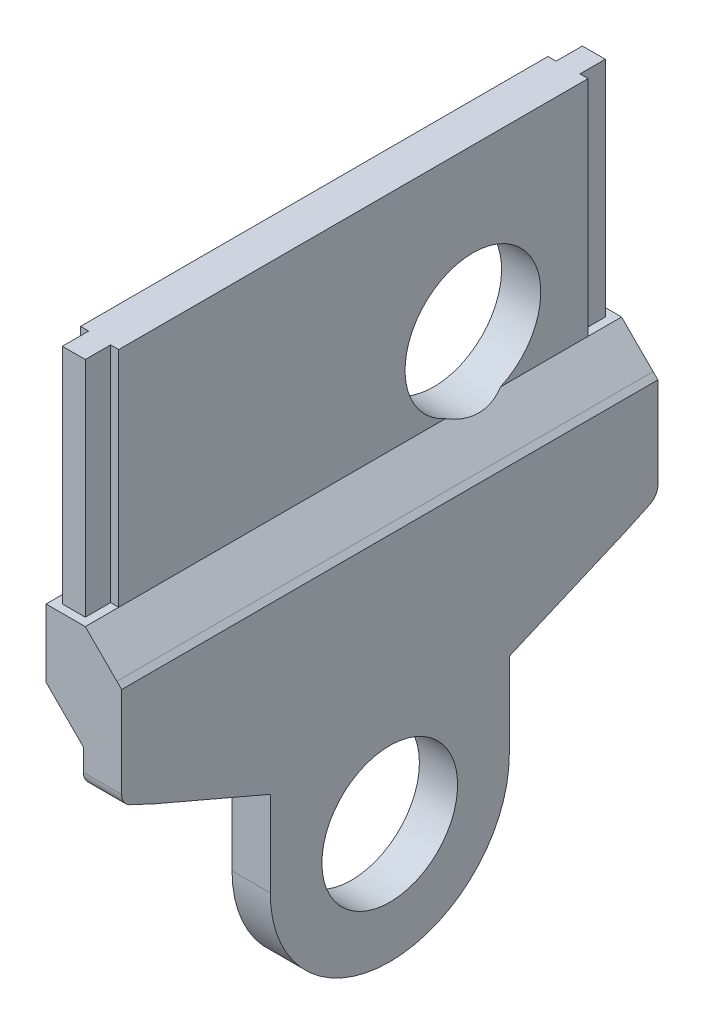
ISO-10303-21;
HEADER;
FILE_DESCRIPTION(('STEP AP214'),'2;1');
FILE_NAME('part.step','',(''),(''),'','','');
FILE_SCHEMA(('AUTOMOTIVE_DESIGN { 1 0 10303 214 1 1 1 1 }'));
ENDSEC;
DATA;
#1=APPLICATION_CONTEXT('core data for automotive mechanical design processes');
#2=APPLICATION_PROTOCOL_DEFINITION('international standard','automotive_design',2000,#1);
#3=PRODUCT_CONTEXT('',#1,'mechanical');
#4=PRODUCT('Part','Part','',(#3));
#5=PRODUCT_RELATED_PRODUCT_CATEGORY('part','',(#4));
#6=PRODUCT_DEFINITION_FORMATION('','',#4);
#7=PRODUCT_DEFINITION_CONTEXT('part definition',#1,'design');
#8=PRODUCT_DEFINITION('design','',#6,#7);
#9=PRODUCT_DEFINITION_SHAPE('','',#8);
#10=(LENGTH_UNIT() NAMED_UNIT(*) SI_UNIT(.MILLI.,.METRE.));
#11=(NAMED_UNIT(*) PLANE_ANGLE_UNIT() SI_UNIT($,.RADIAN.));
#12=(NAMED_UNIT(*) SI_UNIT($,.STERADIAN.) SOLID_ANGLE_UNIT());
#13=UNCERTAINTY_MEASURE_WITH_UNIT(LENGTH_MEASURE(1.E-05),#10,'distance_accuracy_value','');
#14=(GEOMETRIC_REPRESENTATION_CONTEXT(3) GLOBAL_UNCERTAINTY_ASSIGNED_CONTEXT((#13)) GLOBAL_UNIT_ASSIGNED_CONTEXT((#10,
#11,#12)) REPRESENTATION_CONTEXT('',''));
#15=CARTESIAN_POINT('',(0.,0.,0.));
#16=DIRECTION('',(0.,0.,1.));
#17=DIRECTION('',(1.,0.,0.));
#18=AXIS2_PLACEMENT_3D('',#15,#16,#17);
#19=CARTESIAN_POINT('',(-37.3,0.,28.05));
#20=DIRECTION('',(0.,0.,-1.));
#21=DIRECTION('',(-1.,0.,0.));
#22=AXIS2_PLACEMENT_3D('',#19,#20,#21);
#23=PLANE('',#22);
#24=DIRECTION('',(1.,0.,0.));
#25=VECTOR('',#24,1.);
#26=CARTESIAN_POINT('',(-4.55000000000001,-23.3482844211673,28.05));
#27=LINE('',#26,#25);
#28=CARTESIAN_POINT('',(-8.65,-23.3482844211673,28.05));
#29=VERTEX_POINT('',#28);
#30=CARTESIAN_POINT('',(-4.55000000000001,-23.3482844211673,28.05));
#31=VERTEX_POINT('',#30);
#32=EDGE_CURVE('E291',#29,#31,#27,.T.);
#33=ORIENTED_EDGE('',*,*,#32,.F.);
#34=DIRECTION('',(0.,-1.,0.));
#35=VECTOR('',#34,1.);
#36=CARTESIAN_POINT('',(-8.65,-20.6121339458021,28.05));
#37=LINE('',#36,#35);
#38=CARTESIAN_POINT('',(-8.65,-30.45,28.05));
#39=VERTEX_POINT('',#38);
#40=EDGE_CURVE('E509',#29,#39,#37,.T.);
#41=ORIENTED_EDGE('',*,*,#40,.T.);
#42=DIRECTION('',(-0.707106781186542,0.707106781186553,0.));
#43=VECTOR('',#42,1.);
#44=CARTESIAN_POINT('',(-38.1999999999998,-0.899999999999764,28.05));
#45=LINE('',#44,#43);
#46=CARTESIAN_POINT('',(-5.35000000000001,-33.75,28.05));
#47=VERTEX_POINT('',#46);
#48=EDGE_CURVE('E520',#47,#39,#45,.T.);
#49=ORIENTED_EDGE('',*,*,#48,.F.);
#50=DIRECTION('',(-0.707106781186548,0.707106781186547,0.));
#51=VECTOR('',#50,1.);
#52=CARTESIAN_POINT('',(-38.2,-0.900000000000041,28.05));
#53=LINE('',#52,#51);
#54=CARTESIAN_POINT('',(-4.75,-34.3500000000001,28.05));
#55=VERTEX_POINT('',#54);
#56=EDGE_CURVE('E577',#55,#47,#53,.T.);
#57=ORIENTED_EDGE('',*,*,#56,.F.);
#58=DIRECTION('',(0.,-1.,0.));
#59=VECTOR('',#58,1.);
#60=CARTESIAN_POINT('',(-4.75,-33.75,28.05));
#61=LINE('',#60,#59);
#62=CARTESIAN_POINT('',(-4.75,-36.6623178052463,28.05));
#63=VERTEX_POINT('',#62);
#64=EDGE_CURVE('E481',#55,#63,#61,.T.);
#65=ORIENTED_EDGE('',*,*,#64,.T.);
#66=DIRECTION('',(-1.,0.,0.));
#67=VECTOR('',#66,1.);
#68=CARTESIAN_POINT('',(-5.35,-36.6623178052463,28.05));
#69=LINE('',#68,#67);
#70=CARTESIAN_POINT('',(-0.749999999999994,-36.6623178052462,28.05));
#71=VERTEX_POINT('',#70);
#72=EDGE_CURVE('E558',#71,#63,#69,.T.);
#73=ORIENTED_EDGE('',*,*,#72,.F.);
#74=DIRECTION('',(0.,1.,0.));
#75=VECTOR('',#74,1.);
#76=CARTESIAN_POINT('',(-0.749999999999994,-36.6623178052462,28.05));
#77=LINE('',#76,#75);
#78=CARTESIAN_POINT('',(-0.750000000000001,-27.1482844211673,28.05));
#79=VERTEX_POINT('',#78);
#80=EDGE_CURVE('E423',#71,#79,#77,.T.);
#81=ORIENTED_EDGE('',*,*,#80,.T.);
#82=DIRECTION('',(0.707106781186548,-0.707106781186547,0.));
#83=VECTOR('',#82,1.);
#84=CARTESIAN_POINT('',(-0.750000000000001,-27.1482844211673,28.05));
#85=LINE('',#84,#83);
#86=CARTESIAN_POINT('',(-1.25,-26.6482844211673,28.05));
#87=VERTEX_POINT('',#86);
#88=EDGE_CURVE('E298',#87,#79,#85,.T.);
#89=ORIENTED_EDGE('',*,*,#88,.F.);
#90=DIRECTION('',(-0.707106781186546,0.707106781186549,0.));
#91=VECTOR('',#90,1.);
#92=CARTESIAN_POINT('',(-4.55000000000001,-23.3482844211673,28.05));
#93=LINE('',#92,#91);
#94=EDGE_CURVE('E282',#31,#87,#93,.F.);
#95=ORIENTED_EDGE('',*,*,#94,.F.);
#96=EDGE_LOOP('',(#33,#41,#49,#57,#65,#73,#81,#89,#95));
#97=FACE_BOUND('',#96,.T.);
#98=ADVANCED_FACE('F78',(#97),#23,.F.);
#99=CARTESIAN_POINT('',(-8.65,0.,0.));
#100=DIRECTION('',(-1.,0.,0.));
#101=DIRECTION('',(0.,1.,0.));
#102=AXIS2_PLACEMENT_3D('',#99,#100,#101);
#103=PLANE('',#102);
#104=CARTESIAN_POINT('',(-8.65,-16.8599999999996,-12.4999999999987));
#105=DIRECTION('',(1.,0.,0.));
#106=DIRECTION('',(0.,1.,0.));
#107=AXIS2_PLACEMENT_3D('',#104,#105,#106);
#108=CIRCLE('',#107,7.1);
#109=CARTESIAN_POINT('',(-8.65,-9.75999999999956,-12.4999999999987));
#110=VERTEX_POINT('',#109);
#111=EDGE_CURVE('E516',#110,#110,#108,.T.);
#112=ORIENTED_EDGE('',*,*,#111,.T.);
#113=EDGE_LOOP('',(#112));
#114=FACE_BOUND('',#113,.T.);
#115=DIRECTION('',(0.,0.,1.));
#116=VECTOR('',#115,1.);
#117=CARTESIAN_POINT('',(-8.65,0.,0.));
#118=LINE('',#117,#116);
#119=CARTESIAN_POINT('',(-8.65000000000001,0.,-24.45));
#120=VERTEX_POINT('',#119);
#121=CARTESIAN_POINT('',(-8.65,0.,24.45));
#122=VERTEX_POINT('',#121);
#123=EDGE_CURVE('E370',#120,#122,#118,.T.);
#124=ORIENTED_EDGE('',*,*,#123,.F.);
#125=DIRECTION('',(0.,1.,0.));
#126=VECTOR('',#125,1.);
#127=CARTESIAN_POINT('',(-8.65,-23.3482844211673,-24.45));
#128=LINE('',#127,#126);
#129=CARTESIAN_POINT('',(-8.65,-23.3482844211673,-24.45));
#130=VERTEX_POINT('',#129);
#131=EDGE_CURVE('E398',#130,#120,#128,.T.);
#132=ORIENTED_EDGE('',*,*,#131,.F.);
#133=DIRECTION('',(0.,0.,-1.));
#134=VECTOR('',#133,1.);
#135=CARTESIAN_POINT('',(-8.65,-23.3482844211673,-28.05));
#136=LINE('',#135,#134);
#137=CARTESIAN_POINT('',(-8.65,-23.3482844211673,-28.05));
#138=VERTEX_POINT('',#137);
#139=EDGE_CURVE('E389',#130,#138,#136,.T.);
#140=ORIENTED_EDGE('',*,*,#139,.T.);
#141=DIRECTION('',(0.,1.,0.));
#142=VECTOR('',#141,1.);
#143=CARTESIAN_POINT('',(-8.65,-38.4114540690585,-28.05));
#144=LINE('',#143,#142);
#145=CARTESIAN_POINT('',(-8.65,-30.45,-28.05));
#146=VERTEX_POINT('',#145);
#147=EDGE_CURVE('E512',#146,#138,#144,.T.);
#148=ORIENTED_EDGE('',*,*,#147,.F.);
#149=DIRECTION('',(0.,0.,-1.));
#150=VECTOR('',#149,1.);
#151=CARTESIAN_POINT('',(-8.64999999999999,-30.45,0.));
#152=LINE('',#151,#150);
#153=EDGE_CURVE('E570',#39,#146,#152,.T.);
#154=ORIENTED_EDGE('',*,*,#153,.F.);
#155=ORIENTED_EDGE('',*,*,#40,.F.);
#156=DIRECTION('',(0.,0.,1.));
#157=VECTOR('',#156,1.);
#158=CARTESIAN_POINT('',(-8.65,-23.3482844211673,28.05));
#159=LINE('',#158,#157);
#160=CARTESIAN_POINT('',(-8.65,-23.3482844211673,24.45));
#161=VERTEX_POINT('',#160);
#162=EDGE_CURVE('E305',#161,#29,#159,.T.);
#163=ORIENTED_EDGE('',*,*,#162,.F.);
#164=DIRECTION('',(0.,1.,0.));
#165=VECTOR('',#164,1.);
#166=CARTESIAN_POINT('',(-8.65,-23.3482844211673,24.45));
#167=LINE('',#166,#165);
#168=EDGE_CURVE('E332',#161,#122,#167,.T.);
#169=ORIENTED_EDGE('',*,*,#168,.T.);
#170=EDGE_LOOP('',(#124,#132,#140,#148,#154,#155,#163,#169));
#171=FACE_BOUND('',#170,.T.);
#172=ADVANCED_FACE('F662',(#114,#171),#103,.T.);
#173=CARTESIAN_POINT('',(-4.55000000000001,-16.8599999999996,-12.4999999999987));
#174=DIRECTION('',(1.,0.,0.));
#175=DIRECTION('',(0.,0.,1.));
#176=AXIS2_PLACEMENT_3D('',#173,#174,#175);
#177=PLANE('',#176);
#178=DIRECTION('',(0.,0.,1.));
#179=VECTOR('',#178,1.);
#180=CARTESIAN_POINT('',(-4.55000000000001,-23.3482844211673,-9.61691740145388));
#181=LINE('',#180,#179);
#182=CARTESIAN_POINT('',(-4.55000000000001,-23.3482844211673,-9.61691740145388));
#183=VERTEX_POINT('',#182);
#184=CARTESIAN_POINT('',(-4.55000000000001,-23.3482844211673,24.55));
#185=VERTEX_POINT('',#184);
#186=EDGE_CURVE('E285',#183,#185,#181,.T.);
#187=ORIENTED_EDGE('',*,*,#186,.F.);
#188=CARTESIAN_POINT('',(-4.55000000000001,-16.8599999999996,-12.4999999999987));
#189=DIRECTION('',(1.,0.,0.));
#190=DIRECTION('',(0.,0.,1.));
#191=AXIS2_PLACEMENT_3D('',#188,#189,#190);
#192=CIRCLE('',#191,7.1);
#193=CARTESIAN_POINT('',(-4.55000000000001,-23.3482844211673,-15.3830825985434));
#194=VERTEX_POINT('',#193);
#195=EDGE_CURVE('E461',#194,#183,#192,.T.);
#196=ORIENTED_EDGE('',*,*,#195,.F.);
#197=DIRECTION('',(0.,0.,1.));
#198=VECTOR('',#197,1.);
#199=CARTESIAN_POINT('',(-4.55000000000001,-23.3482844211673,-28.05));
#200=LINE('',#199,#198);
#201=CARTESIAN_POINT('',(-4.55000000000001,-23.3482844211673,-24.55));
#202=VERTEX_POINT('',#201);
#203=EDGE_CURVE('E457',#202,#194,#200,.T.);
#204=ORIENTED_EDGE('',*,*,#203,.F.);
#205=DIRECTION('',(0.,1.,0.));
#206=VECTOR('',#205,1.);
#207=CARTESIAN_POINT('',(-4.55000000000001,-23.3482844211673,-24.55));
#208=LINE('',#207,#206);
#209=CARTESIAN_POINT('',(-4.55000000000001,0.,-24.55));
#210=VERTEX_POINT('',#209);
#211=EDGE_CURVE('E397',#202,#210,#208,.T.);
#212=ORIENTED_EDGE('',*,*,#211,.T.);
#213=DIRECTION('',(0.,0.,-1.));
#214=VECTOR('',#213,1.);
#215=CARTESIAN_POINT('',(-4.55000000000001,0.,-12.4999999999987));
#216=LINE('',#215,#214);
#217=CARTESIAN_POINT('',(-4.55000000000001,0.,24.55));
#218=VERTEX_POINT('',#217);
#219=EDGE_CURVE('E366',#218,#210,#216,.T.);
#220=ORIENTED_EDGE('',*,*,#219,.F.);
#221=DIRECTION('',(0.,1.,0.));
#222=VECTOR('',#221,1.);
#223=CARTESIAN_POINT('',(-4.55000000000001,-23.3482844211673,24.55));
#224=LINE('',#223,#222);
#225=EDGE_CURVE('E333',#185,#218,#224,.T.);
#226=ORIENTED_EDGE('',*,*,#225,.F.);
#227=EDGE_LOOP('',(#187,#196,#204,#212,#220,#226));
#228=FACE_BOUND('',#227,.T.);
#229=ADVANCED_FACE('F635',(#228),#177,.T.);
#230=CARTESIAN_POINT('',(-37.3,0.,0.));
#231=DIRECTION('',(0.,1.,0.));
#232=DIRECTION('',(0.,0.,1.));
#233=AXIS2_PLACEMENT_3D('',#230,#231,#232);
#234=PLANE('',#233);
#235=ORIENTED_EDGE('',*,*,#219,.T.);
#236=DIRECTION('',(1.,0.,0.));
#237=VECTOR('',#236,1.);
#238=CARTESIAN_POINT('',(-4.55000000000001,0.,-24.55));
#239=LINE('',#238,#237);
#240=CARTESIAN_POINT('',(-5.40000000000001,0.,-24.55));
#241=VERTEX_POINT('',#240);
#242=EDGE_CURVE('E601',#241,#210,#239,.T.);
#243=ORIENTED_EDGE('',*,*,#242,.F.);
#244=DIRECTION('',(0.,0.,1.));
#245=VECTOR('',#244,1.);
#246=CARTESIAN_POINT('',(-5.40000000000001,0.,-27.2));
#247=LINE('',#246,#245);
#248=CARTESIAN_POINT('',(-5.40000000000001,0.,-27.2));
#249=VERTEX_POINT('',#248);
#250=EDGE_CURVE('E337',#249,#241,#247,.T.);
#251=ORIENTED_EDGE('',*,*,#250,.F.);
#252=DIRECTION('',(1.,0.,0.));
#253=VECTOR('',#252,1.);
#254=CARTESIAN_POINT('',(-5.40000000000001,0.,-27.2));
#255=LINE('',#254,#253);
#256=CARTESIAN_POINT('',(-7.80000000000001,0.,-27.2));
#257=VERTEX_POINT('',#256);
#258=EDGE_CURVE('E354',#257,#249,#255,.T.);
#259=ORIENTED_EDGE('',*,*,#258,.F.);
#260=DIRECTION('',(0.,0.,-1.));
#261=VECTOR('',#260,1.);
#262=CARTESIAN_POINT('',(-7.80000000000001,0.,-27.2));
#263=LINE('',#262,#261);
#264=CARTESIAN_POINT('',(-7.80000000000001,0.,-24.45));
#265=VERTEX_POINT('',#264);
#266=EDGE_CURVE('E358',#265,#257,#263,.T.);
#267=ORIENTED_EDGE('',*,*,#266,.F.);
#268=DIRECTION('',(1.,0.,0.));
#269=VECTOR('',#268,1.);
#270=CARTESIAN_POINT('',(-8.65000000000001,0.,-24.45));
#271=LINE('',#270,#269);
#272=EDGE_CURVE('E362',#120,#265,#271,.T.);
#273=ORIENTED_EDGE('',*,*,#272,.F.);
#274=ORIENTED_EDGE('',*,*,#123,.T.);
#275=DIRECTION('',(-1.,0.,0.));
#276=VECTOR('',#275,1.);
#277=CARTESIAN_POINT('',(-37.3,0.,24.45));
#278=LINE('',#277,#276);
#279=CARTESIAN_POINT('',(-7.80000000000001,0.,24.45));
#280=VERTEX_POINT('',#279);
#281=EDGE_CURVE('E94',#280,#122,#278,.T.);
#282=ORIENTED_EDGE('',*,*,#281,.F.);
#283=DIRECTION('',(0.,0.,-1.));
#284=VECTOR('',#283,1.);
#285=CARTESIAN_POINT('',(-7.80000000000001,0.,0.));
#286=LINE('',#285,#284);
#287=CARTESIAN_POINT('',(-7.80000000000001,0.,27.2));
#288=VERTEX_POINT('',#287);
#289=EDGE_CURVE('E606',#288,#280,#286,.T.);
#290=ORIENTED_EDGE('',*,*,#289,.F.);
#291=DIRECTION('',(-1.,0.,0.));
#292=VECTOR('',#291,1.);
#293=CARTESIAN_POINT('',(-37.3,0.,27.2));
#294=LINE('',#293,#292);
#295=CARTESIAN_POINT('',(-5.40000000000001,0.,27.2));
#296=VERTEX_POINT('',#295);
#297=EDGE_CURVE('E610',#296,#288,#294,.T.);
#298=ORIENTED_EDGE('',*,*,#297,.F.);
#299=DIRECTION('',(0.,0.,1.));
#300=VECTOR('',#299,1.);
#301=CARTESIAN_POINT('',(-5.40000000000001,0.,0.));
#302=LINE('',#301,#300);
#303=CARTESIAN_POINT('',(-5.40000000000001,0.,24.55));
#304=VERTEX_POINT('',#303);
#305=EDGE_CURVE('E87',#304,#296,#302,.T.);
#306=ORIENTED_EDGE('',*,*,#305,.F.);
#307=DIRECTION('',(-1.,0.,0.));
#308=VECTOR('',#307,1.);
#309=CARTESIAN_POINT('',(-37.3,0.,24.55));
#310=LINE('',#309,#308);
#311=EDGE_CURVE('E12',#218,#304,#310,.T.);
#312=ORIENTED_EDGE('',*,*,#311,.F.);
#313=EDGE_LOOP('',(#235,#243,#251,#259,#267,#273,#274,#282,#290,#298,#306,#312));
#314=FACE_BOUND('',#313,.T.);
#315=ADVANCED_FACE('F623',(#314),#234,.T.);
#316=CARTESIAN_POINT('',(-8.65,-23.3482844211673,-24.45));
#317=DIRECTION('',(0.,0.,1.));
#318=DIRECTION('',(-1.,0.,0.));
#319=AXIS2_PLACEMENT_3D('',#316,#317,#318);
#320=PLANE('',#319);
#321=ORIENTED_EDGE('',*,*,#272,.T.);
#322=DIRECTION('',(0.,1.,0.));
#323=VECTOR('',#322,1.);
#324=CARTESIAN_POINT('',(-7.8,-23.3482844211673,-24.45));
#325=LINE('',#324,#323);
#326=CARTESIAN_POINT('',(-7.8,-23.3482844211673,-24.45));
#327=VERTEX_POINT('',#326);
#328=EDGE_CURVE('E403',#327,#265,#325,.T.);
#329=ORIENTED_EDGE('',*,*,#328,.F.);
#330=DIRECTION('',(-1.,0.,0.));
#331=VECTOR('',#330,1.);
#332=CARTESIAN_POINT('',(-8.65,-23.3482844211673,-24.45));
#333=LINE('',#332,#331);
#334=EDGE_CURVE('E386',#327,#130,#333,.T.);
#335=ORIENTED_EDGE('',*,*,#334,.T.);
#336=ORIENTED_EDGE('',*,*,#131,.T.);
#337=EDGE_LOOP('',(#321,#329,#335,#336));
#338=FACE_BOUND('',#337,.T.);
#339=ADVANCED_FACE('F658',(#338),#320,.F.);
#340=CARTESIAN_POINT('',(-7.8,-23.3482844211673,-27.2));
#341=DIRECTION('',(1.,0.,0.));
#342=DIRECTION('',(0.,0.,1.));
#343=AXIS2_PLACEMENT_3D('',#340,#341,#342);
#344=PLANE('',#343);
#345=ORIENTED_EDGE('',*,*,#266,.T.);
#346=DIRECTION('',(0.,1.,0.));
#347=VECTOR('',#346,1.);
#348=CARTESIAN_POINT('',(-7.8,-23.3482844211673,-27.2));
#349=LINE('',#348,#347);
#350=CARTESIAN_POINT('',(-7.8,-23.3482844211673,-27.2));
#351=VERTEX_POINT('',#350);
#352=EDGE_CURVE('E406',#351,#257,#349,.T.);
#353=ORIENTED_EDGE('',*,*,#352,.F.);
#354=DIRECTION('',(0.,0.,1.));
#355=VECTOR('',#354,1.);
#356=CARTESIAN_POINT('',(-7.8,-23.3482844211673,-27.2));
#357=LINE('',#356,#355);
#358=EDGE_CURVE('E383',#351,#327,#357,.T.);
#359=ORIENTED_EDGE('',*,*,#358,.T.);
#360=ORIENTED_EDGE('',*,*,#328,.T.);
#361=EDGE_LOOP('',(#345,#353,#359,#360));
#362=FACE_BOUND('',#361,.T.);
#363=ADVANCED_FACE('F654',(#362),#344,.F.);
#364=CARTESIAN_POINT('',(-5.4,-23.3482844211673,-27.2));
#365=DIRECTION('',(0.,0.,1.));
#366=DIRECTION('',(-1.,0.,0.));
#367=AXIS2_PLACEMENT_3D('',#364,#365,#366);
#368=PLANE('',#367);
#369=ORIENTED_EDGE('',*,*,#258,.T.);
#370=DIRECTION('',(0.,1.,0.));
#371=VECTOR('',#370,1.);
#372=CARTESIAN_POINT('',(-5.4,-23.3482844211673,-27.2));
#373=LINE('',#372,#371);
#374=CARTESIAN_POINT('',(-5.4,-23.3482844211673,-27.2));
#375=VERTEX_POINT('',#374);
#376=EDGE_CURVE('E409',#375,#249,#373,.T.);
#377=ORIENTED_EDGE('',*,*,#376,.F.);
#378=DIRECTION('',(-1.,0.,0.));
#379=VECTOR('',#378,1.);
#380=CARTESIAN_POINT('',(-5.4,-23.3482844211673,-27.2));
#381=LINE('',#380,#379);
#382=EDGE_CURVE('E380',#375,#351,#381,.T.);
#383=ORIENTED_EDGE('',*,*,#382,.T.);
#384=ORIENTED_EDGE('',*,*,#352,.T.);
#385=EDGE_LOOP('',(#369,#377,#383,#384));
#386=FACE_BOUND('',#385,.T.);
#387=ADVANCED_FACE('F651',(#386),#368,.F.);
#388=CARTESIAN_POINT('',(-5.4,-23.3482844211673,-27.2));
#389=DIRECTION('',(-1.,0.,0.));
#390=DIRECTION('',(0.,0.,-1.));
#391=AXIS2_PLACEMENT_3D('',#388,#389,#390);
#392=PLANE('',#391);
#393=ORIENTED_EDGE('',*,*,#250,.T.);
#394=DIRECTION('',(0.,1.,0.));
#395=VECTOR('',#394,1.);
#396=CARTESIAN_POINT('',(-5.4,-23.3482844211673,-24.55));
#397=LINE('',#396,#395);
#398=CARTESIAN_POINT('',(-5.4,-23.3482844211673,-24.55));
#399=VERTEX_POINT('',#398);
#400=EDGE_CURVE('E102',#399,#241,#397,.T.);
#401=ORIENTED_EDGE('',*,*,#400,.F.);
#402=DIRECTION('',(0.,0.,-1.));
#403=VECTOR('',#402,1.);
#404=CARTESIAN_POINT('',(-5.4,-23.3482844211673,-27.2));
#405=LINE('',#404,#403);
#406=EDGE_CURVE('E377',#399,#375,#405,.T.);
#407=ORIENTED_EDGE('',*,*,#406,.T.);
#408=ORIENTED_EDGE('',*,*,#376,.T.);
#409=EDGE_LOOP('',(#393,#401,#407,#408));
#410=FACE_BOUND('',#409,.T.);
#411=ADVANCED_FACE('F647',(#410),#392,.F.);
#412=CARTESIAN_POINT('',(-4.55000000000001,-23.3482844211673,-24.55));
#413=DIRECTION('',(0.,0.,1.));
#414=DIRECTION('',(-1.,0.,0.));
#415=AXIS2_PLACEMENT_3D('',#412,#413,#414);
#416=PLANE('',#415);
#417=ORIENTED_EDGE('',*,*,#242,.T.);
#418=ORIENTED_EDGE('',*,*,#211,.F.);
#419=DIRECTION('',(-1.,0.,0.));
#420=VECTOR('',#419,1.);
#421=CARTESIAN_POINT('',(-4.55000000000001,-23.3482844211673,-24.55));
#422=LINE('',#421,#420);
#423=EDGE_CURVE('E374',#202,#399,#422,.T.);
#424=ORIENTED_EDGE('',*,*,#423,.T.);
#425=ORIENTED_EDGE('',*,*,#400,.T.);
#426=EDGE_LOOP('',(#417,#418,#424,#425));
#427=FACE_BOUND('',#426,.T.);
#428=ADVANCED_FACE('F638',(#427),#416,.F.);
#429=CARTESIAN_POINT('',(-37.3,0.,-28.05));
#430=DIRECTION('',(0.,0.,1.));
#431=DIRECTION('',(-1.,0.,0.));
#432=AXIS2_PLACEMENT_3D('',#429,#430,#431);
#433=PLANE('',#432);
#434=DIRECTION('',(1.,0.,0.));
#435=VECTOR('',#434,1.);
#436=CARTESIAN_POINT('',(-8.65,-23.3482844211673,-28.05));
#437=LINE('',#436,#435);
#438=CARTESIAN_POINT('',(-4.55000000000001,-23.3482844211673,-28.05));
#439=VERTEX_POINT('',#438);
#440=EDGE_CURVE('E393',#138,#439,#437,.T.);
#441=ORIENTED_EDGE('',*,*,#440,.T.);
#442=DIRECTION('',(0.707106781186546,-0.707106781186549,0.));
#443=VECTOR('',#442,1.);
#444=CARTESIAN_POINT('',(-4.55000000000001,-23.3482844211673,-28.05));
#445=LINE('',#444,#443);
#446=CARTESIAN_POINT('',(-1.25,-26.6482844211673,-28.05));
#447=VERTEX_POINT('',#446);
#448=EDGE_CURVE('E589',#447,#439,#445,.F.);
#449=ORIENTED_EDGE('',*,*,#448,.F.);
#450=DIRECTION('',(-0.707106781186548,0.707106781186547,0.));
#451=VECTOR('',#450,1.);
#452=CARTESIAN_POINT('',(-0.750000000000001,-27.1482844211673,-28.05));
#453=LINE('',#452,#451);
#454=CARTESIAN_POINT('',(-0.750000000000001,-27.1482844211673,-28.05));
#455=VERTEX_POINT('',#454);
#456=EDGE_CURVE('E595',#455,#447,#453,.T.);
#457=ORIENTED_EDGE('',*,*,#456,.F.);
#458=DIRECTION('',(0.,-1.,0.));
#459=VECTOR('',#458,1.);
#460=CARTESIAN_POINT('',(-0.750000000000001,-26.6482844211673,-28.05));
#461=LINE('',#460,#459);
#462=CARTESIAN_POINT('',(-0.749999999999994,-36.6623178052462,-28.05));
#463=VERTEX_POINT('',#462);
#464=EDGE_CURVE('E425',#455,#463,#461,.T.);
#465=ORIENTED_EDGE('',*,*,#464,.T.);
#466=DIRECTION('',(-1.,0.,0.));
#467=VECTOR('',#466,1.);
#468=CARTESIAN_POINT('',(-1.85,-36.6623178052463,-28.05));
#469=LINE('',#468,#467);
#470=CARTESIAN_POINT('',(-4.75,-36.6623178052463,-28.05));
#471=VERTEX_POINT('',#470);
#472=EDGE_CURVE('E554',#471,#463,#469,.F.);
#473=ORIENTED_EDGE('',*,*,#472,.F.);
#474=DIRECTION('',(0.,1.,0.));
#475=VECTOR('',#474,1.);
#476=CARTESIAN_POINT('',(-4.75,-36.6623178052463,-28.05));
#477=LINE('',#476,#475);
#478=CARTESIAN_POINT('',(-4.75,-34.3500000000001,-28.05));
#479=VERTEX_POINT('',#478);
#480=EDGE_CURVE('E477',#471,#479,#477,.T.);
#481=ORIENTED_EDGE('',*,*,#480,.T.);
#482=DIRECTION('',(0.707106781186548,-0.707106781186547,0.));
#483=VECTOR('',#482,1.);
#484=CARTESIAN_POINT('',(-38.2,-0.900000000000041,-28.05));
#485=LINE('',#484,#483);
#486=CARTESIAN_POINT('',(-5.35000000000001,-33.75,-28.05));
#487=VERTEX_POINT('',#486);
#488=EDGE_CURVE('E581',#487,#479,#485,.T.);
#489=ORIENTED_EDGE('',*,*,#488,.F.);
#490=DIRECTION('',(-0.707106781186542,0.707106781186553,0.));
#491=VECTOR('',#490,1.);
#492=CARTESIAN_POINT('',(-38.1999999999998,-0.899999999999764,-28.05));
#493=LINE('',#492,#491);
#494=EDGE_CURVE('E551',#487,#146,#493,.T.);
#495=ORIENTED_EDGE('',*,*,#494,.T.);
#496=ORIENTED_EDGE('',*,*,#147,.T.);
#497=EDGE_LOOP('',(#441,#449,#457,#465,#473,#481,#489,#495,#496));
#498=FACE_BOUND('',#497,.T.);
#499=ADVANCED_FACE('F682',(#498),#433,.F.);
#500=CARTESIAN_POINT('',(-68.25,-39.25,24.55));
#501=DIRECTION('',(0.,-0.906307787036652,0.422618261740696));
#502=DIRECTION('',(-1.,0.,0.));
#503=AXIS2_PLACEMENT_3D('',#500,#501,#502);
#504=PLANE('',#503);
#505=DIRECTION('',(1.,0.,0.));
#506=VECTOR('',#505,1.);
#507=CARTESIAN_POINT('',(-68.251,-39.25,24.55));
#508=LINE('',#507,#506);
#509=CARTESIAN_POINT('',(-4.75,-39.25,24.55));
#510=VERTEX_POINT('',#509);
#511=CARTESIAN_POINT('',(-0.749999999999994,-39.25,24.55));
#512=VERTEX_POINT('',#511);
#513=EDGE_CURVE('E534',#510,#512,#508,.T.);
#514=ORIENTED_EDGE('',*,*,#513,.T.);
#515=DIRECTION('',(0.,0.422618261740696,0.906307787036652));
#516=VECTOR('',#515,1.);
#517=CARTESIAN_POINT('',(-0.749999999999994,-39.25,24.55));
#518=LINE('',#517,#516);
#519=CARTESIAN_POINT('',(-0.749999999999994,-38.0217794858012,27.183927392611));
#520=VERTEX_POINT('',#519);
#521=EDGE_CURVE('E453',#512,#520,#518,.T.);
#522=ORIENTED_EDGE('',*,*,#521,.T.);
#523=DIRECTION('',(-1.,0.,0.));
#524=VECTOR('',#523,1.);
#525=CARTESIAN_POINT('',(-1.85,-38.0217794858012,27.183927392611));
#526=LINE('',#525,#524);
#527=CARTESIAN_POINT('',(-4.75,-38.0217794858012,27.1839273926111));
#528=VERTEX_POINT('',#527);
#529=EDGE_CURVE('E566',#528,#520,#526,.F.);
#530=ORIENTED_EDGE('',*,*,#529,.F.);
#531=DIRECTION('',(0.,-0.422618261740696,-0.906307787036652));
#532=VECTOR('',#531,1.);
#533=CARTESIAN_POINT('',(-4.75,-38.0217794858012,27.1839273926111));
#534=LINE('',#533,#532);
#535=EDGE_CURVE('E488',#528,#510,#534,.T.);
#536=ORIENTED_EDGE('',*,*,#535,.T.);
#537=EDGE_LOOP('',(#514,#522,#530,#536));
#538=FACE_BOUND('',#537,.T.);
#539=ADVANCED_FACE('F685',(#538),#504,.T.);
#540=CARTESIAN_POINT('',(-37.3,-37.6179231964575,-28.05));
#541=DIRECTION('',(0.,0.906307787036652,0.422618261740696));
#542=DIRECTION('',(1.,0.,0.));
#543=AXIS2_PLACEMENT_3D('',#540,#541,#542);
#544=PLANE('',#543);
#545=DIRECTION('',(1.,0.,0.));
#546=VECTOR('',#545,1.);
#547=CARTESIAN_POINT('',(-5.35,-38.0217794858012,-27.183927392611));
#548=LINE('',#547,#546);
#549=CARTESIAN_POINT('',(-0.749999999999994,-38.0217794858012,-27.183927392611));
#550=VERTEX_POINT('',#549);
#551=CARTESIAN_POINT('',(-4.75,-38.0217794858012,-27.183927392611));
#552=VERTEX_POINT('',#551);
#553=EDGE_CURVE('E562',#550,#552,#548,.F.);
#554=ORIENTED_EDGE('',*,*,#553,.F.);
#555=DIRECTION('',(0.,-0.422618261740701,0.906307787036649));
#556=VECTOR('',#555,1.);
#557=CARTESIAN_POINT('',(-0.749999999999994,-38.0217794858012,-27.183927392611));
#558=LINE('',#557,#556);
#559=CARTESIAN_POINT('',(-0.749999999999994,-39.25,-24.55));
#560=VERTEX_POINT('',#559);
#561=EDGE_CURVE('E432',#550,#560,#558,.T.);
#562=ORIENTED_EDGE('',*,*,#561,.T.);
#563=DIRECTION('',(1.,0.,0.));
#564=VECTOR('',#563,1.);
#565=CARTESIAN_POINT('',(-68.251,-39.25,-24.55));
#566=LINE('',#565,#564);
#567=CARTESIAN_POINT('',(-4.75,-39.25,-24.55));
#568=VERTEX_POINT('',#567);
#569=EDGE_CURVE('E538',#568,#560,#566,.T.);
#570=ORIENTED_EDGE('',*,*,#569,.F.);
#571=DIRECTION('',(0.,0.422618261740697,-0.906307787036651));
#572=VECTOR('',#571,1.);
#573=CARTESIAN_POINT('',(-4.75,-39.25,-24.55));
#574=LINE('',#573,#572);
#575=EDGE_CURVE('E470',#568,#552,#574,.T.);
#576=ORIENTED_EDGE('',*,*,#575,.T.);
#577=EDGE_LOOP('',(#554,#562,#570,#576));
#578=FACE_BOUND('',#577,.T.);
#579=ADVANCED_FACE('F711',(#578),#544,.F.);
#580=CARTESIAN_POINT('',(-68.251,-53.3482844211673,0.));
#581=DIRECTION('',(1.,0.,0.));
#582=DIRECTION('',(0.,0.,1.));
#583=AXIS2_PLACEMENT_3D('',#580,#581,#582);
#584=CYLINDRICAL_SURFACE('',#583,7.1);
#585=CARTESIAN_POINT('',(-4.75,-53.3482844211673,0.));
#586=DIRECTION('',(1.,0.,0.));
#587=DIRECTION('',(0.,0.,-1.));
#588=AXIS2_PLACEMENT_3D('',#585,#586,#587);
#589=CIRCLE('',#588,7.1);
#590=CARTESIAN_POINT('',(-4.75,-53.3482844211673,-7.09999999999999));
#591=VERTEX_POINT('',#590);
#592=EDGE_CURVE('E505',#591,#591,#589,.F.);
#593=ORIENTED_EDGE('',*,*,#592,.T.);
#594=EDGE_LOOP('',(#593));
#595=FACE_BOUND('',#594,.T.);
#596=CARTESIAN_POINT('',(-0.749999999999994,-53.3482844211673,0.));
#597=DIRECTION('',(-1.,0.,0.));
#598=DIRECTION('',(0.,0.,1.));
#599=AXIS2_PLACEMENT_3D('',#596,#597,#598);
#600=CIRCLE('',#599,7.1);
#601=CARTESIAN_POINT('',(-0.749999999999994,-53.3482844211673,7.10000000000001));
#602=VERTEX_POINT('',#601);
#603=EDGE_CURVE('E402',#602,#602,#600,.T.);
#604=ORIENTED_EDGE('',*,*,#603,.F.);
#605=EDGE_LOOP('',(#604));
#606=FACE_BOUND('',#605,.T.);
#607=ADVANCED_FACE('F707',(#595,#606),#584,.F.);
#608=CARTESIAN_POINT('',(-68.251,-53.3460459383044,0.));
#609=DIRECTION('',(1.,0.,0.));
#610=DIRECTION('',(0.,0.,1.));
#611=AXIS2_PLACEMENT_3D('',#608,#609,#610);
#612=CYLINDRICAL_SURFACE('',#611,12.5);
#613=DIRECTION('',(1.,0.,0.));
#614=VECTOR('',#613,1.);
#615=CARTESIAN_POINT('',(-68.251,-53.3460459383044,-12.5));
#616=LINE('',#615,#614);
#617=CARTESIAN_POINT('',(-4.75,-53.3460459383044,-12.5));
#618=VERTEX_POINT('',#617);
#619=CARTESIAN_POINT('',(-0.749999999999994,-53.3460459383044,-12.5));
#620=VERTEX_POINT('',#619);
#621=EDGE_CURVE('E524',#618,#620,#616,.T.);
#622=ORIENTED_EDGE('',*,*,#621,.T.);
#623=CARTESIAN_POINT('',(-0.749999999999994,-53.3460459383044,0.));
#624=DIRECTION('',(-1.,0.,0.));
#625=DIRECTION('',(0.,0.,1.));
#626=AXIS2_PLACEMENT_3D('',#623,#624,#625);
#627=CIRCLE('',#626,12.5);
#628=CARTESIAN_POINT('',(-0.749999999999994,-53.3460459383044,12.5));
#629=VERTEX_POINT('',#628);
#630=EDGE_CURVE('E442',#620,#629,#627,.T.);
#631=ORIENTED_EDGE('',*,*,#630,.T.);
#632=DIRECTION('',(1.,0.,0.));
#633=VECTOR('',#632,1.);
#634=CARTESIAN_POINT('',(-68.251,-53.3460459383044,12.5));
#635=LINE('',#634,#633);
#636=CARTESIAN_POINT('',(-4.75,-53.3460459383044,12.5));
#637=VERTEX_POINT('',#636);
#638=EDGE_CURVE('E525',#637,#629,#635,.T.);
#639=ORIENTED_EDGE('',*,*,#638,.F.);
#640=CARTESIAN_POINT('',(-4.75,-53.3460459383044,0.));
#641=DIRECTION('',(1.,0.,0.));
#642=DIRECTION('',(0.,0.,-1.));
#643=AXIS2_PLACEMENT_3D('',#640,#641,#642);
#644=CIRCLE('',#643,12.5);
#645=EDGE_CURVE('E498',#637,#618,#644,.T.);
#646=ORIENTED_EDGE('',*,*,#645,.T.);
#647=EDGE_LOOP('',(#622,#631,#639,#646));
#648=FACE_BOUND('',#647,.T.);
#649=ADVANCED_FACE('F691',(#648),#612,.T.);
#650=CARTESIAN_POINT('',(-68.251,0.,12.5));
#651=DIRECTION('',(0.,0.,1.));
#652=DIRECTION('',(0.,-1.,0.));
#653=AXIS2_PLACEMENT_3D('',#650,#651,#652);
#654=PLANE('',#653);
#655=ORIENTED_EDGE('',*,*,#638,.T.);
#656=DIRECTION('',(0.,1.,0.));
#657=VECTOR('',#656,1.);
#658=CARTESIAN_POINT('',(-0.749999999999994,-53.3460459383044,12.5));
#659=LINE('',#658,#657);
#660=CARTESIAN_POINT('',(-0.749999999999994,-44.4160459383044,12.5));
#661=VERTEX_POINT('',#660);
#662=EDGE_CURVE('E446',#629,#661,#659,.T.);
#663=ORIENTED_EDGE('',*,*,#662,.T.);
#664=DIRECTION('',(1.,0.,0.));
#665=VECTOR('',#664,1.);
#666=CARTESIAN_POINT('',(-68.251,-44.4160459383044,12.5));
#667=LINE('',#666,#665);
#668=CARTESIAN_POINT('',(-4.75,-44.4160459383044,12.5));
#669=VERTEX_POINT('',#668);
#670=EDGE_CURVE('E530',#669,#661,#667,.T.);
#671=ORIENTED_EDGE('',*,*,#670,.F.);
#672=DIRECTION('',(0.,-1.,0.));
#673=VECTOR('',#672,1.);
#674=CARTESIAN_POINT('',(-4.75,-44.4160459383044,12.5));
#675=LINE('',#674,#673);
#676=EDGE_CURVE('E495',#669,#637,#675,.T.);
#677=ORIENTED_EDGE('',*,*,#676,.T.);
#678=EDGE_LOOP('',(#655,#663,#671,#677));
#679=FACE_BOUND('',#678,.T.);
#680=ADVANCED_FACE('F687',(#679),#654,.T.);
#681=CARTESIAN_POINT('',(-68.251,-42.0468571075074,18.0262236828801));
#682=DIRECTION('',(0.,-0.919096412163646,0.394032720910223));
#683=DIRECTION('',(0.,-0.394032720910223,-0.919096412163646));
#684=AXIS2_PLACEMENT_3D('',#681,#682,#683);
#685=PLANE('',#684);
#686=ORIENTED_EDGE('',*,*,#670,.T.);
#687=DIRECTION('',(0.,0.394032720910223,0.919096412163646));
#688=VECTOR('',#687,1.);
#689=CARTESIAN_POINT('',(-0.749999999999994,-44.4160459383044,12.5));
#690=LINE('',#689,#688);
#691=EDGE_CURVE('E450',#661,#512,#690,.T.);
#692=ORIENTED_EDGE('',*,*,#691,.T.);
#693=ORIENTED_EDGE('',*,*,#513,.F.);
#694=DIRECTION('',(0.,-0.394032720910224,-0.919096412163645));
#695=VECTOR('',#694,1.);
#696=CARTESIAN_POINT('',(-4.75,-39.25,24.55));
#697=LINE('',#696,#695);
#698=EDGE_CURVE('E492',#510,#669,#697,.T.);
#699=ORIENTED_EDGE('',*,*,#698,.T.);
#700=EDGE_LOOP('',(#686,#692,#693,#699));
#701=FACE_BOUND('',#700,.T.);
#702=ADVANCED_FACE('F690',(#701),#685,.T.);
#703=CARTESIAN_POINT('',(-68.251,-42.0468571075074,-18.0262236828801));
#704=DIRECTION('',(0.,0.919096412163646,0.394032720910223));
#705=DIRECTION('',(0.,-0.394032720910223,0.919096412163646));
#706=AXIS2_PLACEMENT_3D('',#703,#704,#705);
#707=PLANE('',#706);
#708=DIRECTION('',(0.,0.394032720910224,-0.919096412163646));
#709=VECTOR('',#708,1.);
#710=CARTESIAN_POINT('',(-4.75,-44.4160459383044,-12.5));
#711=LINE('',#710,#709);
#712=CARTESIAN_POINT('',(-4.75,-44.4160459383044,-12.5));
#713=VERTEX_POINT('',#712);
#714=EDGE_CURVE('E467',#713,#568,#711,.T.);
#715=ORIENTED_EDGE('',*,*,#714,.T.);
#716=ORIENTED_EDGE('',*,*,#569,.T.);
#717=DIRECTION('',(0.,-0.394032720910223,0.919096412163646));
#718=VECTOR('',#717,1.);
#719=CARTESIAN_POINT('',(-0.749999999999994,-39.25,-24.55));
#720=LINE('',#719,#718);
#721=CARTESIAN_POINT('',(-0.749999999999994,-44.4160459383044,-12.5));
#722=VERTEX_POINT('',#721);
#723=EDGE_CURVE('E436',#560,#722,#720,.T.);
#724=ORIENTED_EDGE('',*,*,#723,.T.);
#725=DIRECTION('',(1.,0.,0.));
#726=VECTOR('',#725,1.);
#727=CARTESIAN_POINT('',(-68.251,-44.4160459383044,-12.5));
#728=LINE('',#727,#726);
#729=EDGE_CURVE('E542',#713,#722,#728,.T.);
#730=ORIENTED_EDGE('',*,*,#729,.F.);
#731=EDGE_LOOP('',(#715,#716,#724,#730));
#732=FACE_BOUND('',#731,.T.);
#733=ADVANCED_FACE('F695',(#732),#707,.F.);
#734=CARTESIAN_POINT('',(-68.251,0.,-12.5));
#735=DIRECTION('',(0.,0.,1.));
#736=DIRECTION('',(0.,-1.,0.));
#737=AXIS2_PLACEMENT_3D('',#734,#735,#736);
#738=PLANE('',#737);
#739=DIRECTION('',(0.,1.,0.));
#740=VECTOR('',#739,1.);
#741=CARTESIAN_POINT('',(-4.75,-53.3460459383044,-12.5));
#742=LINE('',#741,#740);
#743=EDGE_CURVE('E502',#618,#713,#742,.T.);
#744=ORIENTED_EDGE('',*,*,#743,.T.);
#745=ORIENTED_EDGE('',*,*,#729,.T.);
#746=DIRECTION('',(0.,-1.,0.));
#747=VECTOR('',#746,1.);
#748=CARTESIAN_POINT('',(-0.749999999999994,-44.4160459383044,-12.5));
#749=LINE('',#748,#747);
#750=EDGE_CURVE('E440',#722,#620,#749,.T.);
#751=ORIENTED_EDGE('',*,*,#750,.T.);
#752=ORIENTED_EDGE('',*,*,#621,.F.);
#753=EDGE_LOOP('',(#744,#745,#751,#752));
#754=FACE_BOUND('',#753,.T.);
#755=ADVANCED_FACE('F699',(#754),#738,.F.);
#756=CARTESIAN_POINT('',(-37.3,-36.6623178052463,-26.55));
#757=DIRECTION('',(1.,0.,0.));
#758=DIRECTION('',(0.,0.,1.));
#759=AXIS2_PLACEMENT_3D('',#756,#757,#758);
#760=CYLINDRICAL_SURFACE('',#759,1.5);
#761=ORIENTED_EDGE('',*,*,#472,.T.);
#762=CARTESIAN_POINT('',(-0.749999999999994,-36.6623178052462,-26.55));
#763=DIRECTION('',(-1.,0.,0.));
#764=DIRECTION('',(0.,0.,1.));
#765=AXIS2_PLACEMENT_3D('',#762,#763,#764);
#766=CIRCLE('',#765,1.5);
#767=EDGE_CURVE('E429',#463,#550,#766,.T.);
#768=ORIENTED_EDGE('',*,*,#767,.T.);
#769=ORIENTED_EDGE('',*,*,#553,.T.);
#770=CARTESIAN_POINT('',(-4.75,-36.6623178052463,-26.55));
#771=DIRECTION('',(1.,0.,0.));
#772=DIRECTION('',(0.,0.,-1.));
#773=AXIS2_PLACEMENT_3D('',#770,#771,#772);
#774=CIRCLE('',#773,1.5);
#775=EDGE_CURVE('E474',#552,#471,#774,.T.);
#776=ORIENTED_EDGE('',*,*,#775,.T.);
#777=EDGE_LOOP('',(#761,#768,#769,#776));
#778=FACE_BOUND('',#777,.T.);
#779=ADVANCED_FACE('F703',(#778),#760,.T.);
#780=CARTESIAN_POINT('',(-37.3,-36.6623178052463,26.55));
#781=DIRECTION('',(1.,0.,0.));
#782=DIRECTION('',(0.,0.,1.));
#783=AXIS2_PLACEMENT_3D('',#780,#781,#782);
#784=CYLINDRICAL_SURFACE('',#783,1.5);
#785=ORIENTED_EDGE('',*,*,#529,.T.);
#786=CARTESIAN_POINT('',(-0.749999999999994,-36.6623178052462,26.55));
#787=DIRECTION('',(-1.,0.,0.));
#788=DIRECTION('',(0.,0.,1.));
#789=AXIS2_PLACEMENT_3D('',#786,#787,#788);
#790=CIRCLE('',#789,1.5);
#791=EDGE_CURVE('E420',#520,#71,#790,.T.);
#792=ORIENTED_EDGE('',*,*,#791,.T.);
#793=ORIENTED_EDGE('',*,*,#72,.T.);
#794=CARTESIAN_POINT('',(-4.75,-36.6623178052463,26.55));
#795=DIRECTION('',(1.,0.,0.));
#796=DIRECTION('',(0.,0.,-1.));
#797=AXIS2_PLACEMENT_3D('',#794,#795,#796);
#798=CIRCLE('',#797,1.5);
#799=EDGE_CURVE('E485',#63,#528,#798,.T.);
#800=ORIENTED_EDGE('',*,*,#799,.T.);
#801=EDGE_LOOP('',(#785,#792,#793,#800));
#802=FACE_BOUND('',#801,.T.);
#803=ADVANCED_FACE('F717',(#802),#784,.T.);
#804=CARTESIAN_POINT('',(-6.349988,-16.8599999999996,-12.4999999999987));
#805=DIRECTION('',(-1.,0.,0.));
#806=DIRECTION('',(0.,0.,-1.));
#807=AXIS2_PLACEMENT_3D('',#804,#805,#806);
#808=CYLINDRICAL_SURFACE('',#807,7.1);
#809=ORIENTED_EDGE('',*,*,#195,.T.);
#810=CARTESIAN_POINT('',(-11.0382844211677,-16.8599999999996,-12.4999999999987));
#811=DIRECTION('',(0.707106781186549,0.707106781186546,0.));
#812=DIRECTION('',(-0.707106781186546,0.707106781186549,0.));
#813=AXIS2_PLACEMENT_3D('',#810,#811,#812);
#814=ELLIPSE('',#813,10.040916292849,7.1);
#815=EDGE_CURVE('E301',#194,#183,#814,.F.);
#816=ORIENTED_EDGE('',*,*,#815,.F.);
#817=EDGE_LOOP('',(#809,#816));
#818=FACE_BOUND('',#817,.T.);
#819=ORIENTED_EDGE('',*,*,#111,.F.);
#820=EDGE_LOOP('',(#819));
#821=FACE_BOUND('',#820,.T.);
#822=ADVANCED_FACE('F713',(#818,#821),#808,.F.);
#823=CARTESIAN_POINT('',(-5.35000000000001,-33.75,0.));
#824=DIRECTION('',(0.707106781186552,0.707106781186543,0.));
#825=DIRECTION('',(0.,0.,1.));
#826=AXIS2_PLACEMENT_3D('',#823,#824,#825);
#827=PLANE('',#826);
#828=ORIENTED_EDGE('',*,*,#153,.T.);
#829=ORIENTED_EDGE('',*,*,#494,.F.);
#830=DIRECTION('',(0.,0.,1.));
#831=VECTOR('',#830,1.);
#832=CARTESIAN_POINT('',(-5.35000000000001,-33.75,0.));
#833=LINE('',#832,#831);
#834=EDGE_CURVE('E529',#487,#47,#833,.T.);
#835=ORIENTED_EDGE('',*,*,#834,.T.);
#836=ORIENTED_EDGE('',*,*,#48,.T.);
#837=EDGE_LOOP('',(#828,#829,#835,#836));
#838=FACE_BOUND('',#837,.T.);
#839=ADVANCED_FACE('F716',(#838),#827,.F.);
#840=CARTESIAN_POINT('',(-4.75,-36.6623178052463,-26.55));
#841=DIRECTION('',(-1.,0.,0.));
#842=DIRECTION('',(0.,0.,-1.));
#843=AXIS2_PLACEMENT_3D('',#840,#841,#842);
#844=PLANE('',#843);
#845=ORIENTED_EDGE('',*,*,#480,.F.);
#846=ORIENTED_EDGE('',*,*,#775,.F.);
#847=ORIENTED_EDGE('',*,*,#575,.F.);
#848=ORIENTED_EDGE('',*,*,#714,.F.);
#849=ORIENTED_EDGE('',*,*,#743,.F.);
#850=ORIENTED_EDGE('',*,*,#645,.F.);
#851=ORIENTED_EDGE('',*,*,#676,.F.);
#852=ORIENTED_EDGE('',*,*,#698,.F.);
#853=ORIENTED_EDGE('',*,*,#535,.F.);
#854=ORIENTED_EDGE('',*,*,#799,.F.);
#855=ORIENTED_EDGE('',*,*,#64,.F.);
#856=DIRECTION('',(0.,0.,1.));
#857=VECTOR('',#856,1.);
#858=CARTESIAN_POINT('',(-4.75,-34.3500000000001,-26.55));
#859=LINE('',#858,#857);
#860=EDGE_CURVE('E574',#479,#55,#859,.T.);
#861=ORIENTED_EDGE('',*,*,#860,.F.);
#862=EDGE_LOOP('',(#845,#846,#847,#848,#849,#850,#851,#852,#853,#854,#855,#861));
#863=FACE_BOUND('',#862,.T.);
#864=ORIENTED_EDGE('',*,*,#592,.F.);
#865=EDGE_LOOP('',(#864));
#866=FACE_BOUND('',#865,.T.);
#867=ADVANCED_FACE('F721',(#863,#866),#844,.T.);
#868=CARTESIAN_POINT('',(-4.75,-34.3500000000001,-26.55));
#869=DIRECTION('',(0.707106781186547,0.707106781186548,0.));
#870=DIRECTION('',(0.,0.,1.));
#871=AXIS2_PLACEMENT_3D('',#868,#869,#870);
#872=PLANE('',#871);
#873=ORIENTED_EDGE('',*,*,#488,.T.);
#874=ORIENTED_EDGE('',*,*,#860,.T.);
#875=ORIENTED_EDGE('',*,*,#56,.T.);
#876=ORIENTED_EDGE('',*,*,#834,.F.);
#877=EDGE_LOOP('',(#873,#874,#875,#876));
#878=FACE_BOUND('',#877,.T.);
#879=ADVANCED_FACE('F735',(#878),#872,.F.);
#880=CARTESIAN_POINT('',(-4.55000000000001,-23.3482844211673,0.));
#881=DIRECTION('',(-0.707106781186549,-0.707106781186546,0.));
#882=DIRECTION('',(0.,0.,1.));
#883=AXIS2_PLACEMENT_3D('',#880,#881,#882);
#884=PLANE('',#883);
#885=ORIENTED_EDGE('',*,*,#448,.T.);
#886=EDGE_CURVE('E458',#439,#202,#200,.T.);
#887=ORIENTED_EDGE('',*,*,#886,.T.);
#888=ORIENTED_EDGE('',*,*,#203,.T.);
#889=ORIENTED_EDGE('',*,*,#815,.T.);
#890=ORIENTED_EDGE('',*,*,#186,.T.);
#891=DIRECTION('',(0.,0.,-1.));
#892=VECTOR('',#891,1.);
#893=CARTESIAN_POINT('',(-4.55000000000001,-23.3482844211673,28.05));
#894=LINE('',#893,#892);
#895=EDGE_CURVE('E278',#31,#185,#894,.T.);
#896=ORIENTED_EDGE('',*,*,#895,.F.);
#897=ORIENTED_EDGE('',*,*,#94,.T.);
#898=DIRECTION('',(0.,0.,-1.));
#899=VECTOR('',#898,1.);
#900=CARTESIAN_POINT('',(-1.25,-26.6482844211673,0.));
#901=LINE('',#900,#899);
#902=EDGE_CURVE('E300',#87,#447,#901,.T.);
#903=ORIENTED_EDGE('',*,*,#902,.T.);
#904=EDGE_LOOP('',(#885,#887,#888,#889,#890,#896,#897,#903));
#905=FACE_BOUND('',#904,.T.);
#906=ADVANCED_FACE('F281',(#905),#884,.F.);
#907=CARTESIAN_POINT('',(-0.749999999999994,-36.6623178052462,26.55));
#908=DIRECTION('',(1.,0.,0.));
#909=DIRECTION('',(0.,0.,1.));
#910=AXIS2_PLACEMENT_3D('',#907,#908,#909);
#911=PLANE('',#910);
#912=ORIENTED_EDGE('',*,*,#80,.F.);
#913=ORIENTED_EDGE('',*,*,#791,.F.);
#914=ORIENTED_EDGE('',*,*,#521,.F.);
#915=ORIENTED_EDGE('',*,*,#691,.F.);
#916=ORIENTED_EDGE('',*,*,#662,.F.);
#917=ORIENTED_EDGE('',*,*,#630,.F.);
#918=ORIENTED_EDGE('',*,*,#750,.F.);
#919=ORIENTED_EDGE('',*,*,#723,.F.);
#920=ORIENTED_EDGE('',*,*,#561,.F.);
#921=ORIENTED_EDGE('',*,*,#767,.F.);
#922=ORIENTED_EDGE('',*,*,#464,.F.);
#923=DIRECTION('',(0.,0.,-1.));
#924=VECTOR('',#923,1.);
#925=CARTESIAN_POINT('',(-0.750000000000001,-27.1482844211673,-28.05));
#926=LINE('',#925,#924);
#927=EDGE_CURVE('E592',#79,#455,#926,.T.);
#928=ORIENTED_EDGE('',*,*,#927,.F.);
#929=EDGE_LOOP('',(#912,#913,#914,#915,#916,#917,#918,#919,#920,#921,#922,#928));
#930=FACE_BOUND('',#929,.T.);
#931=ORIENTED_EDGE('',*,*,#603,.T.);
#932=EDGE_LOOP('',(#931));
#933=FACE_BOUND('',#932,.T.);
#934=ADVANCED_FACE('F739',(#930,#933),#911,.T.);
#935=CARTESIAN_POINT('',(-0.750000000000001,-27.1482844211673,26.55));
#936=DIRECTION('',(0.707106781186547,0.707106781186548,0.));
#937=DIRECTION('',(0.,0.,1.));
#938=AXIS2_PLACEMENT_3D('',#935,#936,#937);
#939=PLANE('',#938);
#940=ORIENTED_EDGE('',*,*,#88,.T.);
#941=ORIENTED_EDGE('',*,*,#927,.T.);
#942=ORIENTED_EDGE('',*,*,#456,.T.);
#943=ORIENTED_EDGE('',*,*,#902,.F.);
#944=EDGE_LOOP('',(#940,#941,#942,#943));
#945=FACE_BOUND('',#944,.T.);
#946=ADVANCED_FACE('F80',(#945),#939,.T.);
#947=CARTESIAN_POINT('',(-37.3,-23.3482844211673,0.));
#948=DIRECTION('',(0.,1.,0.));
#949=DIRECTION('',(0.,0.,1.));
#950=AXIS2_PLACEMENT_3D('',#947,#948,#949);
#951=PLANE('',#950);
#952=ORIENTED_EDGE('',*,*,#886,.F.);
#953=ORIENTED_EDGE('',*,*,#440,.F.);
#954=ORIENTED_EDGE('',*,*,#139,.F.);
#955=ORIENTED_EDGE('',*,*,#334,.F.);
#956=ORIENTED_EDGE('',*,*,#358,.F.);
#957=ORIENTED_EDGE('',*,*,#382,.F.);
#958=ORIENTED_EDGE('',*,*,#406,.F.);
#959=ORIENTED_EDGE('',*,*,#423,.F.);
#960=EDGE_LOOP('',(#952,#953,#954,#955,#956,#957,#958,#959));
#961=FACE_BOUND('',#960,.T.);
#962=ADVANCED_FACE('F643',(#961),#951,.T.);
#963=CARTESIAN_POINT('',(-4.55000000000001,-23.3482844211673,24.55));
#964=DIRECTION('',(0.,0.,1.));
#965=DIRECTION('',(-1.,0.,0.));
#966=AXIS2_PLACEMENT_3D('',#963,#964,#965);
#967=PLANE('',#966);
#968=ORIENTED_EDGE('',*,*,#225,.T.);
#969=ORIENTED_EDGE('',*,*,#311,.T.);
#970=DIRECTION('',(0.,1.,0.));
#971=VECTOR('',#970,1.);
#972=CARTESIAN_POINT('',(-5.4,-23.3482844211673,24.55));
#973=LINE('',#972,#971);
#974=CARTESIAN_POINT('',(-5.4,-23.3482844211673,24.55));
#975=VERTEX_POINT('',#974);
#976=EDGE_CURVE('E338',#975,#304,#973,.T.);
#977=ORIENTED_EDGE('',*,*,#976,.F.);
#978=DIRECTION('',(-1.,0.,0.));
#979=VECTOR('',#978,1.);
#980=CARTESIAN_POINT('',(-4.55000000000001,-23.3482844211673,24.55));
#981=LINE('',#980,#979);
#982=EDGE_CURVE('E329',#185,#975,#981,.T.);
#983=ORIENTED_EDGE('',*,*,#982,.F.);
#984=EDGE_LOOP('',(#968,#969,#977,#983));
#985=FACE_BOUND('',#984,.T.);
#986=ADVANCED_FACE('F628',(#985),#967,.T.);
#987=CARTESIAN_POINT('',(-5.4,-23.3482844211673,27.2));
#988=DIRECTION('',(1.,0.,0.));
#989=DIRECTION('',(0.,0.,1.));
#990=AXIS2_PLACEMENT_3D('',#987,#988,#989);
#991=PLANE('',#990);
#992=ORIENTED_EDGE('',*,*,#976,.T.);
#993=ORIENTED_EDGE('',*,*,#305,.T.);
#994=DIRECTION('',(0.,1.,0.));
#995=VECTOR('',#994,1.);
#996=CARTESIAN_POINT('',(-5.4,-23.3482844211673,27.2));
#997=LINE('',#996,#995);
#998=CARTESIAN_POINT('',(-5.4,-23.3482844211673,27.2));
#999=VERTEX_POINT('',#998);
#1000=EDGE_CURVE('E341',#999,#296,#997,.T.);
#1001=ORIENTED_EDGE('',*,*,#1000,.F.);
#1002=DIRECTION('',(0.,0.,1.));
#1003=VECTOR('',#1002,1.);
#1004=CARTESIAN_POINT('',(-5.4,-23.3482844211673,27.2));
#1005=LINE('',#1004,#1003);
#1006=EDGE_CURVE('E325',#975,#999,#1005,.T.);
#1007=ORIENTED_EDGE('',*,*,#1006,.F.);
#1008=EDGE_LOOP('',(#992,#993,#1001,#1007));
#1009=FACE_BOUND('',#1008,.T.);
#1010=ADVANCED_FACE('F619',(#1009),#991,.T.);
#1011=CARTESIAN_POINT('',(-5.4,-23.3482844211673,27.2));
#1012=DIRECTION('',(0.,0.,1.));
#1013=DIRECTION('',(-1.,0.,0.));
#1014=AXIS2_PLACEMENT_3D('',#1011,#1012,#1013);
#1015=PLANE('',#1014);
#1016=ORIENTED_EDGE('',*,*,#1000,.T.);
#1017=ORIENTED_EDGE('',*,*,#297,.T.);
#1018=DIRECTION('',(0.,1.,0.));
#1019=VECTOR('',#1018,1.);
#1020=CARTESIAN_POINT('',(-7.8,-23.3482844211673,27.2));
#1021=LINE('',#1020,#1019);
#1022=CARTESIAN_POINT('',(-7.8,-23.3482844211673,27.2));
#1023=VERTEX_POINT('',#1022);
#1024=EDGE_CURVE('E344',#1023,#288,#1021,.T.);
#1025=ORIENTED_EDGE('',*,*,#1024,.F.);
#1026=DIRECTION('',(-1.,0.,0.));
#1027=VECTOR('',#1026,1.);
#1028=CARTESIAN_POINT('',(-5.4,-23.3482844211673,27.2));
#1029=LINE('',#1028,#1027);
#1030=EDGE_CURVE('E321',#999,#1023,#1029,.T.);
#1031=ORIENTED_EDGE('',*,*,#1030,.F.);
#1032=EDGE_LOOP('',(#1016,#1017,#1025,#1031));
#1033=FACE_BOUND('',#1032,.T.);
#1034=ADVANCED_FACE('F626',(#1033),#1015,.T.);
#1035=CARTESIAN_POINT('',(-7.8,-23.3482844211673,27.2));
#1036=DIRECTION('',(-1.,0.,0.));
#1037=DIRECTION('',(0.,0.,-1.));
#1038=AXIS2_PLACEMENT_3D('',#1035,#1036,#1037);
#1039=PLANE('',#1038);
#1040=ORIENTED_EDGE('',*,*,#1024,.T.);
#1041=ORIENTED_EDGE('',*,*,#289,.T.);
#1042=DIRECTION('',(0.,1.,0.));
#1043=VECTOR('',#1042,1.);
#1044=CARTESIAN_POINT('',(-7.8,-23.3482844211673,24.45));
#1045=LINE('',#1044,#1043);
#1046=CARTESIAN_POINT('',(-7.8,-23.3482844211673,24.45));
#1047=VERTEX_POINT('',#1046);
#1048=EDGE_CURVE('E347',#1047,#280,#1045,.T.);
#1049=ORIENTED_EDGE('',*,*,#1048,.F.);
#1050=DIRECTION('',(0.,0.,-1.));
#1051=VECTOR('',#1050,1.);
#1052=CARTESIAN_POINT('',(-7.8,-23.3482844211673,27.2));
#1053=LINE('',#1052,#1051);
#1054=EDGE_CURVE('E317',#1023,#1047,#1053,.T.);
#1055=ORIENTED_EDGE('',*,*,#1054,.F.);
#1056=EDGE_LOOP('',(#1040,#1041,#1049,#1055));
#1057=FACE_BOUND('',#1056,.T.);
#1058=ADVANCED_FACE('F666',(#1057),#1039,.T.);
#1059=CARTESIAN_POINT('',(-8.65,-23.3482844211673,24.45));
#1060=DIRECTION('',(0.,0.,1.));
#1061=DIRECTION('',(-1.,0.,0.));
#1062=AXIS2_PLACEMENT_3D('',#1059,#1060,#1061);
#1063=PLANE('',#1062);
#1064=ORIENTED_EDGE('',*,*,#1048,.T.);
#1065=ORIENTED_EDGE('',*,*,#281,.T.);
#1066=ORIENTED_EDGE('',*,*,#168,.F.);
#1067=DIRECTION('',(-1.,0.,0.));
#1068=VECTOR('',#1067,1.);
#1069=CARTESIAN_POINT('',(-8.65,-23.3482844211673,24.45));
#1070=LINE('',#1069,#1068);
#1071=EDGE_CURVE('E312',#1047,#161,#1070,.T.);
#1072=ORIENTED_EDGE('',*,*,#1071,.F.);
#1073=EDGE_LOOP('',(#1064,#1065,#1066,#1072));
#1074=FACE_BOUND('',#1073,.T.);
#1075=ADVANCED_FACE('F663',(#1074),#1063,.T.);
#1076=CARTESIAN_POINT('',(-37.3,-23.3482844211673,0.));
#1077=DIRECTION('',(0.,1.,0.));
#1078=DIRECTION('',(0.,0.,-1.));
#1079=AXIS2_PLACEMENT_3D('',#1076,#1077,#1078);
#1080=PLANE('',#1079);
#1081=ORIENTED_EDGE('',*,*,#895,.T.);
#1082=ORIENTED_EDGE('',*,*,#982,.T.);
#1083=ORIENTED_EDGE('',*,*,#1006,.T.);
#1084=ORIENTED_EDGE('',*,*,#1030,.T.);
#1085=ORIENTED_EDGE('',*,*,#1054,.T.);
#1086=ORIENTED_EDGE('',*,*,#1071,.T.);
#1087=ORIENTED_EDGE('',*,*,#162,.T.);
#1088=ORIENTED_EDGE('',*,*,#32,.T.);
#1089=EDGE_LOOP('',(#1081,#1082,#1083,#1084,#1085,#1086,#1087,#1088));
#1090=FACE_BOUND('',#1089,.T.);
#1091=ADVANCED_FACE('F303',(#1090),#1080,.T.);
#1092=CLOSED_SHELL('',(#98,#172,#229,#315,#339,#363,#387,#411,#428,#499,#539,#579,#607,#649,
#680,#702,#733,#755,#779,#803,#822,#839,#867,#879,#906,#934,#946,#962,#986,#1010,#1034,#1058,
#1075,#1091));
#1093=MANIFOLD_SOLID_BREP('B2',#1092);
#1094=ADVANCED_BREP_SHAPE_REPRESENTATION('',(#18,#1093),#14);
#1095=SHAPE_DEFINITION_REPRESENTATION(#9,#1094);
ENDSEC;
END-ISO-10303-21;
